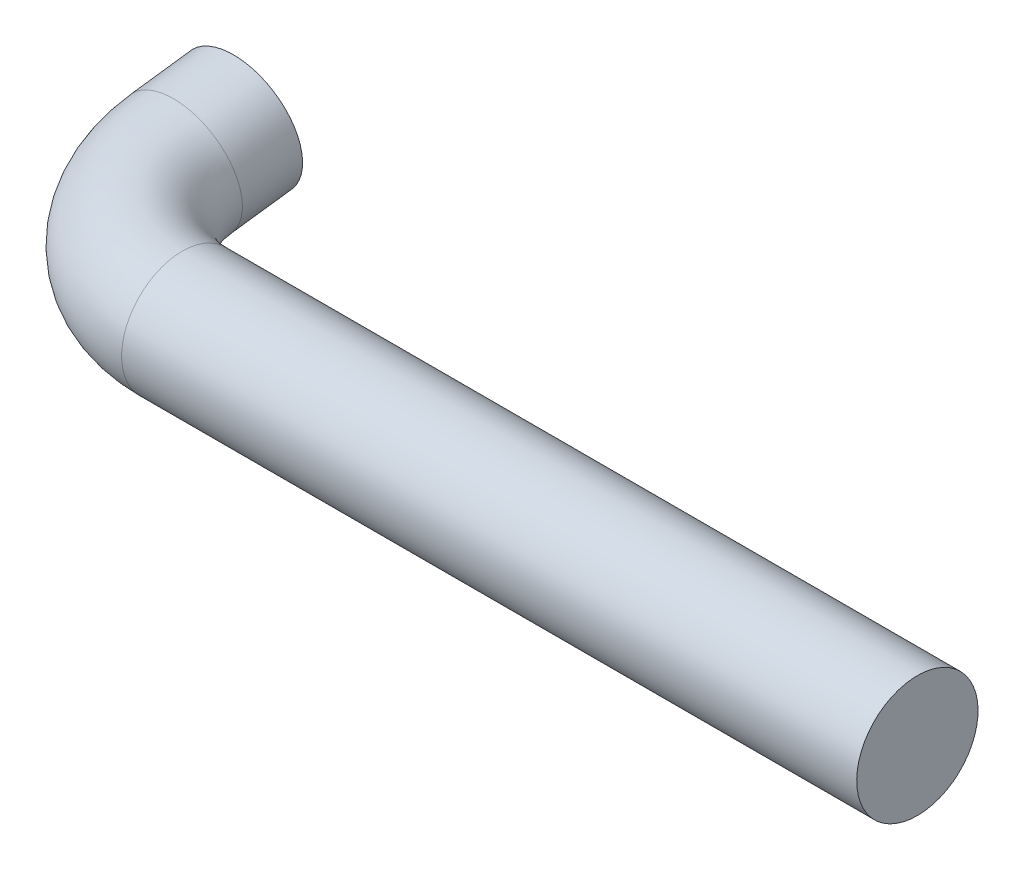
ISO-10303-21;
HEADER;
FILE_DESCRIPTION(('STEP AP214'),'2;1');
FILE_NAME('part.step','',(''),(''),'','','');
FILE_SCHEMA(('AUTOMOTIVE_DESIGN { 1 0 10303 214 1 1 1 1 }'));
ENDSEC;
DATA;
#1=APPLICATION_CONTEXT('core data for automotive mechanical design processes');
#2=APPLICATION_PROTOCOL_DEFINITION('international standard','automotive_design',2000,#1);
#3=PRODUCT_CONTEXT('',#1,'mechanical');
#4=PRODUCT('Part','Part','',(#3));
#5=PRODUCT_RELATED_PRODUCT_CATEGORY('part','',(#4));
#6=PRODUCT_DEFINITION_FORMATION('','',#4);
#7=PRODUCT_DEFINITION_CONTEXT('part definition',#1,'design');
#8=PRODUCT_DEFINITION('design','',#6,#7);
#9=PRODUCT_DEFINITION_SHAPE('','',#8);
#10=(LENGTH_UNIT() NAMED_UNIT(*) SI_UNIT(.MILLI.,.METRE.));
#11=(NAMED_UNIT(*) PLANE_ANGLE_UNIT() SI_UNIT($,.RADIAN.));
#12=(NAMED_UNIT(*) SI_UNIT($,.STERADIAN.) SOLID_ANGLE_UNIT());
#13=UNCERTAINTY_MEASURE_WITH_UNIT(LENGTH_MEASURE(1.E-05),#10,'distance_accuracy_value','');
#14=(GEOMETRIC_REPRESENTATION_CONTEXT(3) GLOBAL_UNCERTAINTY_ASSIGNED_CONTEXT((#13)) GLOBAL_UNIT_ASSIGNED_CONTEXT((#10,
#11,#12)) REPRESENTATION_CONTEXT('',''));
#15=CARTESIAN_POINT('',(0.,0.,0.));
#16=DIRECTION('',(0.,0.,1.));
#17=DIRECTION('',(1.,0.,0.));
#18=AXIS2_PLACEMENT_3D('',#15,#16,#17);
#19=CARTESIAN_POINT('',(56.7,2.652509785563,34.287475540671));
#20=DIRECTION('',(1.,0.,0.));
#21=DIRECTION('',(0.,1.,0.));
#22=AXIS2_PLACEMENT_3D('',#19,#20,#21);
#23=PLANE('',#22);
#24=CARTESIAN_POINT('',(56.7,2.652509785563,34.287475540671));
#25=DIRECTION('',(-1.,0.,0.));
#26=DIRECTION('',(0.,-0.991562225918097,-0.129631601596019));
#27=AXIS2_PLACEMENT_3D('',#24,#25,#26);
#28=CIRCLE('',#27,1.5);
#29=CARTESIAN_POINT('',(56.7,1.16516644668585,34.093028138277));
#30=VERTEX_POINT('',#29);
#31=EDGE_CURVE('E47',#30,#30,#28,.T.);
#32=ORIENTED_EDGE('',*,*,#31,.F.);
#33=EDGE_LOOP('',(#32));
#34=FACE_BOUND('',#33,.T.);
#35=ADVANCED_FACE('F14',(#34),#23,.T.);
#36=CARTESIAN_POINT('',(38.525036827418,2.652509785563,34.287475540671));
#37=DIRECTION('',(1.,0.,0.));
#38=DIRECTION('',(0.,-0.991562225918098,-0.129631601596013));
#39=AXIS2_PLACEMENT_3D('',#36,#37,#38);
#40=CYLINDRICAL_SURFACE('',#39,1.5);
#41=ORIENTED_EDGE('',*,*,#31,.T.);
#42=CARTESIAN_POINT('',(38.525036827418,1.16516644668585,34.093028138277));
#43=DIRECTION('',(1.,0.,0.));
#44=VECTOR('',#43,1.);
#45=LINE('',#42,#44);
#46=CARTESIAN_POINT('',(38.525036827418,1.1651664466864,34.0930281382766));
#47=VERTEX_POINT('',#46);
#48=EDGE_CURVE('E51',#47,#30,#45,.T.);
#49=ORIENTED_EDGE('',*,*,#48,.F.);
#50=CARTESIAN_POINT('',(38.525036827418,1.16516644668696,34.0930281382761));
#51=CARTESIAN_POINT('',(38.525036827418,1.16198428905221,34.1173646938345));
#52=CARTESIAN_POINT('',(38.525036827418,1.1594004612545,34.1417794271937));
#53=CARTESIAN_POINT('',(38.525036827418,1.1554334088696,34.1907062473126));
#54=CARTESIAN_POINT('',(38.525036827418,1.1540501842824,34.2152183340723));
#55=CARTESIAN_POINT('',(38.525036827418,1.15248828185492,34.2642808587907));
#56=CARTESIAN_POINT('',(38.525036827418,1.15230960401465,34.2888312967494));
#57=CARTESIAN_POINT('',(38.525036827418,1.15315706175374,34.3379113664302));
#58=CARTESIAN_POINT('',(38.525036827418,1.15418319733311,34.3624409981522));
#59=CARTESIAN_POINT('',(38.525036827418,1.15743785374516,34.4114203648868));
#60=CARTESIAN_POINT('',(38.525036827418,1.15966637457783,34.4358700998993));
#61=CARTESIAN_POINT('',(38.525036827418,1.16532042103587,34.4846307707081));
#62=CARTESIAN_POINT('',(38.525036827418,1.16874594666124,34.5089417065044));
#63=CARTESIAN_POINT('',(38.525036827418,1.17678575346415,34.5573662119625));
#64=CARTESIAN_POINT('',(38.525036827418,1.18140003464168,34.5814797816244));
#65=CARTESIAN_POINT('',(38.525036827418,1.19180623549716,34.6294514630437));
#66=CARTESIAN_POINT('',(38.525036827418,1.1975981551751,34.6533095748012));
#67=CARTESIAN_POINT('',(38.525036827418,1.21034568001579,34.7007128641492));
#68=CARTESIAN_POINT('',(38.525036827418,1.21730128517854,34.7242580417398));
#69=CARTESIAN_POINT('',(38.525036827418,1.23235942426614,34.7709787403539));
#70=CARTESIAN_POINT('',(38.525036827418,1.240461958191,34.7941542613775));
#71=CARTESIAN_POINT('',(38.525036827418,1.25779443510516,34.8400798149989));
#72=CARTESIAN_POINT('',(38.525036827418,1.26702437809445,34.8628298475967));
#73=CARTESIAN_POINT('',(38.525036827418,1.28658943739201,34.9078496175451));
#74=CARTESIAN_POINT('',(38.525036827418,1.29692455370028,34.9301193548956));
#75=CARTESIAN_POINT('',(38.525036827418,1.31867506143651,34.9741248846016));
#76=CARTESIAN_POINT('',(38.525036827418,1.33009045286447,34.995860676957));
#77=CARTESIAN_POINT('',(38.525036827418,1.35397401016198,35.0387459532452));
#78=CARTESIAN_POINT('',(38.525036827418,1.36644217603151,35.0598954371779));
#79=CARTESIAN_POINT('',(38.525036827418,1.39240124530858,35.1015571456614));
#80=CARTESIAN_POINT('',(38.525036827418,1.4058921487161,35.1220693702122));
#81=CARTESIAN_POINT('',(38.525036827418,1.43386419230116,35.1624071441861));
#82=CARTESIAN_POINT('',(38.525036827418,1.44834533247868,35.1822326936093));
#83=CARTESIAN_POINT('',(38.525036827418,1.47826296326864,35.221149355843));
#84=CARTESIAN_POINT('',(38.525036827418,1.49369945388108,35.2402404686535));
#85=CARTESIAN_POINT('',(38.525036827418,1.52549059768292,35.2776422654989));
#86=CARTESIAN_POINT('',(38.525036827418,1.54184525087231,35.2959529495338));
#87=CARTESIAN_POINT('',(38.525036827418,1.57543332003602,35.3317497767864));
#88=CARTESIAN_POINT('',(38.525036827418,1.59266673601033,35.349235920004));
#89=CARTESIAN_POINT('',(38.525036827418,1.62797081393533,35.3833415399714));
#90=CARTESIAN_POINT('',(38.525036827418,1.64604147588602,35.3999610167212));
#91=CARTESIAN_POINT('',(38.525036827418,1.68297651195631,35.4322932659776));
#92=CARTESIAN_POINT('',(38.525036827418,1.70184088607593,35.4480060384843));
#93=CARTESIAN_POINT('',(38.525036827418,1.7403179005545,35.4784870258094));
#94=CARTESIAN_POINT('',(38.525036827418,1.75993054091346,35.4932552406277));
#95=CARTESIAN_POINT('',(38.525036827418,1.79985683930225,35.5218115346531));
#96=CARTESIAN_POINT('',(38.525036827418,1.82017049733208,35.5355996138601));
#97=CARTESIAN_POINT('',(38.525036827418,1.86144989368112,35.5621624199723));
#98=CARTESIAN_POINT('',(38.525036827418,1.88241563200035,35.5749371468775));
#99=CARTESIAN_POINT('',(38.525036827418,1.9249486806282,35.5994424729499));
#100=CARTESIAN_POINT('',(38.525036827418,1.94651599093684,35.6111730721171));
#101=CARTESIAN_POINT('',(38.525036827418,1.9902002260039,35.6335618826729));
#102=CARTESIAN_POINT('',(38.525036827418,2.01231715076233,35.6442200940614));
#103=CARTESIAN_POINT('',(38.525036827418,2.05704733312004,35.6644384524948));
#104=CARTESIAN_POINT('',(38.525036827418,2.07966059071932,35.6739985995397));
#105=CARTESIAN_POINT('',(38.525036827418,2.12532896144047,35.6919977980543));
#106=CARTESIAN_POINT('',(38.525036827418,2.14838407456235,35.7004368495241));
#107=CARTESIAN_POINT('',(38.525036827418,2.1948806145418,35.7161735264743));
#108=CARTESIAN_POINT('',(38.525036827418,2.21832204139938,35.7234711519547));
#109=CARTESIAN_POINT('',(38.525036827418,2.26553473639971,35.7369073963072));
#110=CARTESIAN_POINT('',(38.525036827418,2.28930600454246,35.7430460151793));
#111=CARTESIAN_POINT('',(38.525036827418,2.33712111504606,35.7541494578447));
#112=CARTESIAN_POINT('',(38.525036827418,2.36116495740691,35.759114281638));
#113=CARTESIAN_POINT('',(38.525036827418,2.40946729262448,35.7678581734503));
#114=CARTESIAN_POINT('',(38.525036827418,2.43372578548119,35.7716372414693));
#115=CARTESIAN_POINT('',(38.525036827418,2.48239898085639,35.7780005176273));
#116=CARTESIAN_POINT('',(38.525036827418,2.50681368337488,35.7805847257662));
#117=CARTESIAN_POINT('',(38.525036827418,2.55574048091679,35.7845520565802));
#118=CARTESIAN_POINT('',(38.525036827418,2.58025257594022,35.7859351792553));
#119=CARTESIAN_POINT('',(38.525036827418,2.62931510670808,35.7874970070779));
#120=CARTESIAN_POINT('',(38.525036827418,2.65386554245252,35.7876757122255));
#121=CARTESIAN_POINT('',(38.525036827418,2.70294561051234,35.7868282744767));
#122=CARTESIAN_POINT('',(38.525036827418,2.72747524282773,35.7858021315803));
#123=CARTESIAN_POINT('',(38.525036827418,2.77645460999665,35.7825474698119));
#124=CARTESIAN_POINT('',(38.525036827418,2.80090434485019,35.7803189509398));
#125=CARTESIAN_POINT('',(38.525036827418,2.84966501554262,35.774664905917));
#126=CARTESIAN_POINT('',(38.525036827418,2.8739759513815,35.7712393797663));
#127=CARTESIAN_POINT('',(38.525036827418,2.9224004568708,35.7631995725788));
#128=CARTESIAN_POINT('',(38.525036827418,2.94651402652122,35.758585291542));
#129=CARTESIAN_POINT('',(38.525036827418,2.99448570793218,35.7481790907896));
#130=CARTESIAN_POINT('',(38.525036827418,3.01834381969273,35.742387171074));
#131=CARTESIAN_POINT('',(38.525036827418,3.06574710904302,35.7296396462057));
#132=CARTESIAN_POINT('',(38.525036827418,3.08929228663276,35.722684041053));
#133=CARTESIAN_POINT('',(38.525036827418,3.13601298524629,35.7076259019728));
#134=CARTESIAN_POINT('',(38.525036827418,3.15918850627008,35.6995233680452));
#135=CARTESIAN_POINT('',(38.525036827418,3.20511405989164,35.6821908911291));
#136=CARTESIAN_POINT('',(38.525036827418,3.2278640924894,35.6729609481405));
#137=CARTESIAN_POINT('',(38.525036827418,3.27288386243771,35.6533958888435));
#138=CARTESIAN_POINT('',(38.525036827418,3.29515359978826,35.6430607725351));
#139=CARTESIAN_POINT('',(38.525036827418,3.33915912949425,35.6213102647987));
#140=CARTESIAN_POINT('',(38.525036827418,3.3608949218497,35.6098948733708));
#141=CARTESIAN_POINT('',(38.525036827418,3.40378019813788,35.5860113160733));
#142=CARTESIAN_POINT('',(38.525036827418,3.42492968207062,35.5735431502037));
#143=CARTESIAN_POINT('',(38.525036827418,3.46659139055411,35.5475840809267));
#144=CARTESIAN_POINT('',(38.525036827418,3.48710361510486,35.5340931775191));
#145=CARTESIAN_POINT('',(38.525036827418,3.52744138907878,35.5061211339341));
#146=CARTESIAN_POINT('',(38.525036827418,3.54726693850195,35.4916399937566));
#147=CARTESIAN_POINT('',(38.525036827418,3.58618360073563,35.4617223629666));
#148=CARTESIAN_POINT('',(38.525036827418,3.60527471354614,35.4462858723542));
#149=CARTESIAN_POINT('',(38.525036827418,3.64267651039156,35.4144947285523));
#150=CARTESIAN_POINT('',(38.525036827418,3.66098719442648,35.3981400753629));
#151=CARTESIAN_POINT('',(38.525036827418,3.69678402167903,35.3645520061992));
#152=CARTESIAN_POINT('',(38.525036827418,3.71427016489667,35.3473185902249));
#153=CARTESIAN_POINT('',(38.525036827418,3.74837578486407,35.3120145122999));
#154=CARTESIAN_POINT('',(38.525036827418,3.76499526161382,35.2939438503492));
#155=CARTESIAN_POINT('',(38.525036827418,3.79732751087027,35.2570088142789));
#156=CARTESIAN_POINT('',(38.525036827418,3.81304028337696,35.2381444401593));
#157=CARTESIAN_POINT('',(38.525036827418,3.84352127070202,35.1996674256808));
#158=CARTESIAN_POINT('',(38.525036827418,3.85828948552039,35.1800547853218));
#159=CARTESIAN_POINT('',(38.525036827418,3.88684577954578,35.140128486933));
#160=CARTESIAN_POINT('',(38.525036827418,3.9006338587528,35.1198148289032));
#161=CARTESIAN_POINT('',(38.525036827418,3.92719666486499,35.0785354325541));
#162=CARTESIAN_POINT('',(38.525036827418,3.93997139177015,35.0575696942349));
#163=CARTESIAN_POINT('',(38.525036827418,3.96447671784256,35.0150366456071));
#164=CARTESIAN_POINT('',(38.525036827418,3.97620731700982,34.9934693352984));
#165=CARTESIAN_POINT('',(38.525036827418,3.99859612756555,34.9497851002314));
#166=CARTESIAN_POINT('',(38.525036827418,4.00925433895403,34.9276681754729));
#167=CARTESIAN_POINT('',(38.525036827418,4.02947269738742,34.8829379931152));
#168=CARTESIAN_POINT('',(38.525036827418,4.03903284443234,34.8603247355159));
#169=CARTESIAN_POINT('',(38.525036827418,4.057032042947,34.8146563647948));
#170=CARTESIAN_POINT('',(38.525036827418,4.06547109441675,34.7916012516729));
#171=CARTESIAN_POINT('',(38.525036827418,4.08120777136693,34.7451047116934));
#172=CARTESIAN_POINT('',(38.525036827418,4.08850539684735,34.7216632848359));
#173=CARTESIAN_POINT('',(38.525036827418,4.10194164119989,34.6744505898355));
#174=CARTESIAN_POINT('',(38.525036827418,4.108080260072,34.6506793216928));
#175=CARTESIAN_POINT('',(38.525036827418,4.11918370273738,34.6028642111892));
#176=CARTESIAN_POINT('',(38.525036827418,4.12414852653065,34.5788203688283));
#177=CARTESIAN_POINT('',(38.525036827418,4.13289241834295,34.5305180336108));
#178=CARTESIAN_POINT('',(38.525036827418,4.13667148636198,34.5062595407541));
#179=CARTESIAN_POINT('',(38.525036827418,4.14303476251994,34.4575863453789));
#180=CARTESIAN_POINT('',(38.525036827418,4.14561897065887,34.4331716428604));
#181=CARTESIAN_POINT('',(38.525036827418,4.14958630147288,34.3842448453185));
#182=CARTESIAN_POINT('',(38.525036827418,4.15096942414795,34.359732750295));
#183=CARTESIAN_POINT('',(38.525036827418,4.15253125197058,34.3106702195272));
#184=CARTESIAN_POINT('',(38.525036827418,4.15270995711812,34.2861197837827));
#185=CARTESIAN_POINT('',(38.525036827418,4.15186251936934,34.2370397157229));
#186=CARTESIAN_POINT('',(38.525036827418,4.150836376473,34.2125100834075));
#187=CARTESIAN_POINT('',(38.525036827418,4.14758171470457,34.1635307162386));
#188=CARTESIAN_POINT('',(38.525036827418,4.14535319583247,34.1390809813851));
#189=CARTESIAN_POINT('',(38.525036827418,4.13969915080967,34.0903203106926));
#190=CARTESIAN_POINT('',(38.525036827418,4.13627362465897,34.0660093748538));
#191=CARTESIAN_POINT('',(38.525036827418,4.12823381747149,34.0175848693645));
#192=CARTESIAN_POINT('',(38.525036827418,4.12361953643472,33.993471299714));
#193=CARTESIAN_POINT('',(38.525036827418,4.11321333568229,33.9454996183031));
#194=CARTESIAN_POINT('',(38.525036827418,4.10742141596663,33.9216415065425));
#195=CARTESIAN_POINT('',(38.525036827418,4.09467389109833,33.8742382171922));
#196=CARTESIAN_POINT('',(38.525036827418,4.08771828594569,33.8506930396025));
#197=CARTESIAN_POINT('',(38.525036827418,4.07266014686548,33.803972340989));
#198=CARTESIAN_POINT('',(38.525036827418,4.06455761293791,33.7807968199652));
#199=CARTESIAN_POINT('',(38.525036827418,4.04722513602178,33.7348712663436));
#200=CARTESIAN_POINT('',(38.525036827418,4.03799519303321,33.7121212337458));
#201=CARTESIAN_POINT('',(38.525036827418,4.01843013373618,33.6671014637975));
#202=CARTESIAN_POINT('',(38.525036827418,4.00809501742772,33.644831726447));
#203=CARTESIAN_POINT('',(38.525036827418,3.98634450969135,33.600826196741));
#204=CARTESIAN_POINT('',(38.525036827418,3.97492911826343,33.5790904043856));
#205=CARTESIAN_POINT('',(38.525036827418,3.95104556096597,33.5362051280974));
#206=CARTESIAN_POINT('',(38.525036827418,3.93857739509642,33.5150556441646));
#207=CARTESIAN_POINT('',(38.525036827418,3.91261832581934,33.4733939356811));
#208=CARTESIAN_POINT('',(38.525036827418,3.89912742241182,33.4528817111304));
#209=CARTESIAN_POINT('',(38.525036827418,3.87115537882677,33.4125439371565));
#210=CARTESIAN_POINT('',(38.525036827418,3.85667423864925,33.3927183877333));
#211=CARTESIAN_POINT('',(38.525036827418,3.82675660785928,33.3538017254996));
#212=CARTESIAN_POINT('',(38.525036827418,3.81132011724684,33.3347106126891));
#213=CARTESIAN_POINT('',(38.525036827418,3.77952897344501,33.2973088158437));
#214=CARTESIAN_POINT('',(38.525036827418,3.76317432025562,33.2789981318088));
#215=CARTESIAN_POINT('',(38.525036827418,3.72958625109191,33.2432013045562));
#216=CARTESIAN_POINT('',(38.525036827418,3.71235283511759,33.2257151613386));
#217=CARTESIAN_POINT('',(38.525036827418,3.6770487571926,33.1916095413712));
#218=CARTESIAN_POINT('',(38.525036827418,3.65897809524191,33.1749900646214));
#219=CARTESIAN_POINT('',(38.525036827418,3.62204305917161,33.142657815365));
#220=CARTESIAN_POINT('',(38.525036827418,3.603178685052,33.1269450428583));
#221=CARTESIAN_POINT('',(38.525036827418,3.56470167057342,33.0964640555332));
#222=CARTESIAN_POINT('',(38.525036827418,3.54508903021446,33.0816958407149));
#223=CARTESIAN_POINT('',(38.525036827418,3.50516273182568,33.0531395466895));
#224=CARTESIAN_POINT('',(38.525036827418,3.48484907379585,33.0393514674824));
#225=CARTESIAN_POINT('',(38.525036827418,3.44356967744681,33.0127886613703));
#226=CARTESIAN_POINT('',(38.525036827418,3.42260393912758,33.0000139344651));
#227=CARTESIAN_POINT('',(38.525036827418,3.38007089049972,32.9755086083927));
#228=CARTESIAN_POINT('',(38.525036827418,3.35850358019109,32.9637780092254));
#229=CARTESIAN_POINT('',(38.525036827418,3.31481934512403,32.9413891986697));
#230=CARTESIAN_POINT('',(38.525036827418,3.2927024203656,32.9307309872812));
#231=CARTESIAN_POINT('',(38.525036827418,3.24797223800789,32.9105126288478));
#232=CARTESIAN_POINT('',(38.525036827418,3.22535898040861,32.9009524818029));
#233=CARTESIAN_POINT('',(38.525036827418,3.17969060968746,32.8829532832882));
#234=CARTESIAN_POINT('',(38.525036827418,3.15663549656558,32.8745142318185));
#235=CARTESIAN_POINT('',(38.525036827418,3.11013895658612,32.8587775548683));
#236=CARTESIAN_POINT('',(38.525036827418,3.08669752972855,32.8514799293879));
#237=CARTESIAN_POINT('',(38.525036827418,3.03948483472822,32.8380436850354));
#238=CARTESIAN_POINT('',(38.525036827418,3.01571356658547,32.8319050661633));
#239=CARTESIAN_POINT('',(38.525036827418,2.96789845608187,32.8208016234979));
#240=CARTESIAN_POINT('',(38.525036827418,2.94385461372102,32.8158367997046));
#241=CARTESIAN_POINT('',(38.525036827418,2.89555227850345,32.8070929078923));
#242=CARTESIAN_POINT('',(38.525036827418,2.87129378564674,32.8033138398733));
#243=CARTESIAN_POINT('',(38.525036827418,2.82262059027154,32.7969505637153));
#244=CARTESIAN_POINT('',(38.525036827418,2.79820588775305,32.7943663555764));
#245=CARTESIAN_POINT('',(38.525036827418,2.74927909021114,32.7903990247624));
#246=CARTESIAN_POINT('',(38.525036827418,2.72476699518771,32.7890159020873));
#247=CARTESIAN_POINT('',(38.525036827418,2.67570446441985,32.7874540742647));
#248=CARTESIAN_POINT('',(38.525036827418,2.65115402867541,32.7872753691171));
#249=CARTESIAN_POINT('',(38.525036827418,2.60207396061558,32.7881228068659));
#250=CARTESIAN_POINT('',(38.525036827418,2.5775443283002,32.7891489497623));
#251=CARTESIAN_POINT('',(38.525036827418,2.52856496113128,32.7924036115307));
#252=CARTESIAN_POINT('',(38.525036827418,2.50411522627774,32.7946321304028));
#253=CARTESIAN_POINT('',(38.525036827418,2.45535455558531,32.8002861754256));
#254=CARTESIAN_POINT('',(38.525036827418,2.43104361974643,32.8037117015763));
#255=CARTESIAN_POINT('',(38.525036827418,2.38261911425713,32.8117515087638));
#256=CARTESIAN_POINT('',(38.525036827418,2.35850554460671,32.8163657898005));
#257=CARTESIAN_POINT('',(38.525036827418,2.31053386319575,32.826771990553));
#258=CARTESIAN_POINT('',(38.525036827418,2.2866757514352,32.8325639102686));
#259=CARTESIAN_POINT('',(38.525036827418,2.23927246208491,32.8453114351369));
#260=CARTESIAN_POINT('',(38.525036827418,2.21572728449517,32.8522670402896));
#261=CARTESIAN_POINT('',(38.525036827418,2.16900658588164,32.8673251793698));
#262=CARTESIAN_POINT('',(38.525036827418,2.14583106485785,32.8754277132973));
#263=CARTESIAN_POINT('',(38.525036827418,2.09990551123629,32.8927601902135));
#264=CARTESIAN_POINT('',(38.525036827418,2.07715547863852,32.901990133202));
#265=CARTESIAN_POINT('',(38.525036827418,2.03213570869021,32.9215551924991));
#266=CARTESIAN_POINT('',(38.525036827418,2.00986597133967,32.9318903088075));
#267=CARTESIAN_POINT('',(38.525036827418,1.96586044163368,32.9536408165439));
#268=CARTESIAN_POINT('',(38.525036827418,1.94412464927823,32.9650562079718));
#269=CARTESIAN_POINT('',(38.525036827418,1.90123937299004,32.9889397652693));
#270=CARTESIAN_POINT('',(38.525036827418,1.88008988905731,33.0014079311388));
#271=CARTESIAN_POINT('',(38.525036827418,1.83842818057382,33.0273670004159));
#272=CARTESIAN_POINT('',(38.525036827418,1.81791595602307,33.0408579038234));
#273=CARTESIAN_POINT('',(38.525036827418,1.77757818204915,33.0688299474085));
#274=CARTESIAN_POINT('',(38.525036827418,1.75775263262598,33.083311087586));
#275=CARTESIAN_POINT('',(38.525036827418,1.7188359703923,33.113228718376));
#276=CARTESIAN_POINT('',(38.525036827418,1.69974485758179,33.1286652089884));
#277=CARTESIAN_POINT('',(38.525036827418,1.66234306073636,33.1604563527902));
#278=CARTESIAN_POINT('',(38.525036827418,1.64403237670145,33.1768110059796));
#279=CARTESIAN_POINT('',(38.525036827418,1.6082355494489,33.2103990751433));
#280=CARTESIAN_POINT('',(38.525036827418,1.59074940623128,33.2276324911177));
#281=CARTESIAN_POINT('',(38.525036827418,1.55664378626384,33.2629365690427));
#282=CARTESIAN_POINT('',(38.525036827418,1.54002430951403,33.2810072309933));
#283=CARTESIAN_POINT('',(38.525036827418,1.50769206025773,33.3179422670636));
#284=CARTESIAN_POINT('',(38.525036827418,1.49197928775123,33.3368066411833));
#285=CARTESIAN_POINT('',(38.525036827418,1.46149830042565,33.3752836556618));
#286=CARTESIAN_POINT('',(38.525036827418,1.44673008560656,33.3948962960206));
#287=CARTESIAN_POINT('',(38.525036827418,1.41817379158312,33.4348225944098));
#288=CARTESIAN_POINT('',(38.525036827418,1.40438571237877,33.4551362524401));
#289=CARTESIAN_POINT('',(38.525036827418,1.37782290625929,33.4964156487878));
#290=CARTESIAN_POINT('',(38.525036827418,1.36504817934415,33.5173813871052));
#291=CARTESIAN_POINT('',(38.525036827418,1.34054285329899,33.559914435738));
#292=CARTESIAN_POINT('',(38.525036827418,1.32881225416897,33.5814817460534));
#293=CARTESIAN_POINT('',(38.525036827418,1.30642344351151,33.625165981102));
#294=CARTESIAN_POINT('',(38.525036827418,1.29576523198406,33.6472829058353));
#295=CARTESIAN_POINT('',(38.525036827418,1.27554687393033,33.6920130882617));
#296=CARTESIAN_POINT('',(38.525036827418,1.26598672740405,33.7146263459549));
#297=CARTESIAN_POINT('',(38.525036827418,1.24798752747246,33.7602947164195));
#298=CARTESIAN_POINT('',(38.525036827418,1.23954847406716,33.783349829191));
#299=CARTESIAN_POINT('',(38.525036827418,1.22381180240501,33.8298463701278));
#300=CARTESIAN_POINT('',(38.525036827418,1.21651418414816,33.853287798293));
#301=CARTESIAN_POINT('',(38.525036827418,1.20307792006045,33.9005004897208));
#302=CARTESIAN_POINT('',(38.525036827418,1.1969392742296,33.9242717529833));
#303=CARTESIAN_POINT('',(38.525036827418,1.18583590521687,33.9720868768198));
#304=CARTESIAN_POINT('',(38.525036827418,1.180871182035,33.9961307373938));
#305=CARTESIAN_POINT('',(38.525036827418,1.17212701534725,34.0444330228522));
#306=CARTESIAN_POINT('',(38.525036827418,1.16834757184137,34.0686914477367));
#307=CARTESIAN_POINT('',(38.525036827418,1.16516644668697,34.0930281382761));
#308=B_SPLINE_CURVE_WITH_KNOTS('',3,(#50,#51,#52,#53,#54,#55,#56,#57,#58,#59,#60,#61,#62,#63,
#64,#65,#66,#67,#68,#69,#70,#71,#72,#73,#74,#75,#76,#77,#78,#79,#80,#81,#82,#83,#84,#85,#86,#87,
#88,#89,#90,#91,#92,#93,#94,#95,#96,#97,#98,#99,#100,#101,#102,#103,#104,#105,#106,#107,#108,
#109,#110,#111,#112,#113,#114,#115,#116,#117,#118,#119,#120,#121,#122,#123,#124,#125,#126,#127,
#128,#129,#130,#131,#132,#133,#134,#135,#136,#137,#138,#139,#140,#141,#142,#143,#144,#145,#146,
#147,#148,#149,#150,#151,#152,#153,#154,#155,#156,#157,#158,#159,#160,#161,#162,#163,#164,#165,
#166,#167,#168,#169,#170,#171,#172,#173,#174,#175,#176,#177,#178,#179,#180,#181,#182,#183,#184,
#185,#186,#187,#188,#189,#190,#191,#192,#193,#194,#195,#196,#197,#198,#199,#200,#201,#202,#203,
#204,#205,#206,#207,#208,#209,#210,#211,#212,#213,#214,#215,#216,#217,#218,#219,#220,#221,#222,
#223,#224,#225,#226,#227,#228,#229,#230,#231,#232,#233,#234,#235,#236,#237,#238,#239,#240,#241,
#242,#243,#244,#245,#246,#247,#248,#249,#250,#251,#252,#253,#254,#255,#256,#257,#258,#259,#260,
#261,#262,#263,#264,#265,#266,#267,#268,#269,#270,#271,#272,#273,#274,#275,#276,#277,#278,#279,
#280,#281,#282,#283,#284,#285,#286,#287,#288,#289,#290,#291,#292,#293,#294,#295,#296,#297,#298,
#299,#300,#301,#302,#303,#304,#305,#306,#307),.UNSPECIFIED.,.F.,.F.,(4,2,2,2,2,2,2,2,2,2,2,2,2,
2,2,2,2,2,2,2,2,2,2,2,2,2,2,2,2,2,2,2,2,2,2,2,2,2,2,2,2,2,2,2,2,2,2,2,2,2,2,2,2,2,2,2,2,2,2,2,2,
2,2,2,2,2,2,2,2,2,2,2,2,2,2,2,2,2,2,2,2,2,2,2,2,2,2,2,2,2,2,2,2,2,2,2,2,2,2,2,2,2,2,2,2,2,2,2,2,
2,2,2,2,2,2,2,2,2,2,2,2,2,2,2,2,2,2,2,4),(0.,0.0736236855687353,0.147247371137472,
0.220871056706209,0.294494742274941,0.368118427843682,0.441742113412415,0.515365798981158,
0.588989484549892,0.662613170118631,0.736236855687367,0.809860541256099,0.88348422682484,
0.957107912393578,1.03073159796231,1.10435528353105,1.17797896909978,1.25160265466852,
1.32522634023726,1.398850025806,1.47247371137473,1.54609739694347,1.61972108251221,
1.69334476808094,1.76696845364968,1.84059213921842,1.91421582478715,1.98783951035589,
2.06146319592463,2.13508688149336,2.2087105670621,2.28233425263084,2.35595793819957,
2.42958162376831,2.50320530933705,2.57682899490578,2.65045268047452,2.72407636604326,
2.79770005161199,2.87132373718073,2.94494742274947,3.01857110831821,3.09219479388694,
3.16581847945568,3.23944216502442,3.31306585059315,3.38668953616189,3.46031322173063,
3.53393690729936,3.6075605928681,3.68118427843684,3.75480796400557,3.82843164957431,
3.90205533514304,3.97567902071179,4.04930270628052,4.12292639184926,4.19655007741799,
4.27017376298673,4.34379744855547,4.41742113412421,4.49104481969294,4.56466850526168,
4.63829219083042,4.71191587639915,4.78553956196789,4.85916324753663,4.93278693310536,
5.0064106186741,5.08003430424284,5.15365798981158,5.22728167538031,5.30090536094905,
5.37452904651778,5.44815273208652,5.52177641765526,5.59540010322399,5.66902378879273,
5.74264747436147,5.8162711599302,5.88989484549894,5.96351853106768,6.03714221663641,
6.11076590220515,6.18438958777389,6.25801327334263,6.33163695891136,6.4052606444801,
6.47888433004883,6.55250801561757,6.62613170118631,6.69975538675505,6.77337907232378,
6.84700275789252,6.92062644346125,6.99425012902999,7.06787381459873,7.14149750016747,
7.2151211857362,7.28874487130494,7.36236855687368,7.43599224244241,7.50961592801115,
7.58323961357989,7.65686329914862,7.73048698471736,7.8041106702861,7.87773435585483,
7.95135804142357,8.02498172699231,8.09860541256104,8.17222909812978,8.24585278369852,
8.31947646926725,8.39310015483599,8.46672384040473,8.54034752597347,8.6139712115422,
8.68759489711094,8.76121858267968,8.83484226824841,8.90846595381715,8.98208963938589,
9.05571332495462,9.12933701052336,9.2029606960921,9.27658438166083,9.35020806722957,
9.42383175279831),.UNSPECIFIED.);
#309=EDGE_CURVE('E42',#47,#47,#308,.T.);
#310=ORIENTED_EDGE('',*,*,#309,.F.);
#311=ORIENTED_EDGE('',*,*,#48,.T.);
#312=EDGE_LOOP('',(#41,#49,#310,#311));
#313=FACE_BOUND('',#312,.T.);
#314=ADVANCED_FACE('F57',(#313),#40,.T.);
#315=CARTESIAN_POINT('',(35.525036827418,3.235851992747,29.82544552404));
#316=DIRECTION('',(0.,-0.129631601596013,0.991562225918098));
#317=DIRECTION('',(-1.,0.,0.));
#318=AXIS2_PLACEMENT_3D('',#315,#316,#317);
#319=PLANE('',#318);
#320=CARTESIAN_POINT('',(35.525036827418,3.235851992747,29.82544552404));
#321=DIRECTION('',(0.,-0.129631601596013,0.991562225918098));
#322=DIRECTION('',(0.,-0.991562225918098,-0.129631601596012));
#323=AXIS2_PLACEMENT_3D('',#320,#321,#322);
#324=CIRCLE('',#323,1.5);
#325=CARTESIAN_POINT('',(35.525036827418,1.74850865386989,29.6309981216457));
#326=VERTEX_POINT('',#325);
#327=EDGE_CURVE('E107',#326,#326,#324,.T.);
#328=ORIENTED_EDGE('',*,*,#327,.F.);
#329=EDGE_LOOP('',(#328));
#330=FACE_BOUND('',#329,.T.);
#331=ADVANCED_FACE('F66',(#330),#319,.F.);
#332=CARTESIAN_POINT('',(38.525036827418,3.041404590352,31.312788862917));
#333=DIRECTION('',(0.,-0.991562225918098,-0.129631601596013));
#334=DIRECTION('',(-1.,0.,0.));
#335=AXIS2_PLACEMENT_3D('',#332,#333,#334);
#336=TOROIDAL_SURFACE('',#335,3.,1.5);
#337=CARTESIAN_POINT('',(35.525036827418,1.55406125147485,31.118341460523));
#338=CARTESIAN_POINT('',(35.5250357861517,1.54769796868574,31.1670147066207));
#339=CARTESIAN_POINT('',(35.5262415760426,1.54133469738218,31.2156878648644));
#340=CARTESIAN_POINT('',(35.5310593415625,1.5286234783096,31.3129169704418));
#341=CARTESIAN_POINT('',(35.5346713171915,1.52227553054057,31.3614729177754));
#342=CARTESIAN_POINT('',(35.5442939776114,1.50961025910044,31.4583505663303));
#343=CARTESIAN_POINT('',(35.5503046624024,1.50329293542935,31.5066722675516));
#344=CARTESIAN_POINT('',(35.5647099326451,1.49070412908081,31.6029650286602));
#345=CARTESIAN_POINT('',(35.5731045180969,1.48443264640337,31.6509360885475));
#346=CARTESIAN_POINT('',(35.59225745432,1.47195063115334,31.7464119962188));
#347=CARTESIAN_POINT('',(35.6030158050913,1.46574009858075,31.7939168440028));
#348=CARTESIAN_POINT('',(35.6268703305778,1.45339494510728,31.8883458852762));
#349=CARTESIAN_POINT('',(35.639966505293,1.4472603242064,31.9352700787657));
#350=CARTESIAN_POINT('',(35.6684651351501,1.43508177295565,32.0284247666502));
#351=CARTESIAN_POINT('',(35.6838675902918,1.42903784260578,32.0746552610453));
#352=CARTESIAN_POINT('',(35.7169416734464,1.41705523280387,32.1663111775133));
#353=CARTESIAN_POINT('',(35.7346133014592,1.41111655335183,32.2117365995862));
#354=CARTESIAN_POINT('',(35.7721831583095,1.39935875214743,32.301672937567));
#355=CARTESIAN_POINT('',(35.792081387147,1.39353963039507,32.346183853475));
#356=CARTESIAN_POINT('',(35.8340565089489,1.38203496336326,32.4341839484368));
#357=CARTESIAN_POINT('',(35.8561334019134,1.37634941808381,32.4776731274907));
#358=CARTESIAN_POINT('',(35.902412666833,1.3651256009746,32.5635249795012));
#359=CARTESIAN_POINT('',(35.9266150387882,1.35958732914484,32.6058876524579));
#360=CARTESIAN_POINT('',(35.9770869560467,1.34867140111688,32.6893844368847));
#361=CARTESIAN_POINT('',(36.00335650135,1.34329374491868,32.7305185483549));
#362=CARTESIAN_POINT('',(36.0578994796714,1.33271200339867,32.8114591141312));
#363=CARTESIAN_POINT('',(36.0861729126895,1.32750791807686,32.8512655684373));
#364=CARTESIAN_POINT('',(36.1446555532633,1.31728585540699,32.9294549226505));
#365=CARTESIAN_POINT('',(36.174864760819,1.31226787805893,32.9678378225575));
#366=CARTESIAN_POINT('',(36.2371461738412,1.30243012008352,33.0430876002047));
#367=CARTESIAN_POINT('',(36.2692183793077,1.29761033945616,33.0799544779448));
#368=CARTESIAN_POINT('',(36.3351485233992,1.28818058619585,33.1520833957206));
#369=CARTESIAN_POINT('',(36.3690064620243,1.28357061356289,33.1873454357561));
#370=CARTESIAN_POINT('',(36.4384265056932,1.27457158211923,33.2561797287798));
#371=CARTESIAN_POINT('',(36.473988610737,1.27018252330853,33.2897519817678));
#372=CARTESIAN_POINT('',(36.5467313150176,1.26163589313649,33.3551258221983));
#373=CARTESIAN_POINT('',(36.5839119142543,1.25747832177516,33.3869274096407));
#374=CARTESIAN_POINT('',(36.6598020356005,1.24940468245543,33.4486833061703));
#375=CARTESIAN_POINT('',(36.6985115577099,1.24548861449704,33.4786376152574));
#376=CARTESIAN_POINT('',(36.7773662701722,1.23790741613389,33.5366267925224));
#377=CARTESIAN_POINT('',(36.817511460525,1.23424228572914,33.5646616607001));
#378=CARTESIAN_POINT('',(36.8991407961941,1.22717179209353,33.6187444176926));
#379=CARTESIAN_POINT('',(36.9406249415104,1.22376642886267,33.6447923065074));
#380=CARTESIAN_POINT('',(37.0248322481669,1.21722367339284,33.6948383531305));
#381=CARTESIAN_POINT('',(37.067555409507,1.21408628115387,33.7188365109389));
#382=CARTESIAN_POINT('',(37.1541378243736,1.20808702592165,33.7647252818764));
#383=CARTESIAN_POINT('',(37.1979970779002,1.2052251629284,33.7866158950056));
#384=CARTESIAN_POINT('',(37.2867460163547,1.19978386066203,33.8282368402127));
#385=CARTESIAN_POINT('',(37.3316357012827,1.19720442138891,33.8479671722906));
#386=CARTESIAN_POINT('',(37.4223373593633,1.19233418067369,33.8852200231764));
#387=CARTESIAN_POINT('',(37.4681493325159,1.19004337923158,33.9027425419843));
#388=CARTESIAN_POINT('',(37.5605852019673,1.18575593286094,33.9355375534973));
#389=CARTESIAN_POINT('',(37.6072090982662,1.1837592879324,33.9508100462022));
#390=CARTESIAN_POINT('',(37.7011564930435,1.18006496490075,33.9790682110588));
#391=CARTESIAN_POINT('',(37.7484799915219,1.17836728679763,33.9920538832105));
#392=CARTESIAN_POINT('',(37.843712583895,1.17527498645351,34.0157071296001));
#393=CARTESIAN_POINT('',(37.8916216777897,1.1738803642125,34.026374703838));
#394=CARTESIAN_POINT('',(37.9879100449498,1.17139753841464,34.0453660319122));
#395=CARTESIAN_POINT('',(38.0362893182152,1.17030933485779,34.0536897857484));
#396=CARTESIAN_POINT('',(38.1334014898889,1.16844195660481,34.0679735075752));
#397=CARTESIAN_POINT('',(38.1821343882973,1.16766278190868,34.0739334755658));
#398=CARTESIAN_POINT('',(38.2798364245615,1.16641538102683,34.083474942151));
#399=CARTESIAN_POINT('',(38.3288055624173,1.16594715484111,34.0870564407457));
#400=CARTESIAN_POINT('',(38.4268620464542,1.16532262018066,34.0918335550485));
#401=CARTESIAN_POINT('',(38.4759493926353,1.16516631170592,34.0930291707567));
#402=CARTESIAN_POINT('',(38.525036827418,1.16516644668694,34.0930281382763));
#403=B_SPLINE_CURVE_WITH_KNOTS('',3,(#337,#338,#339,#340,#341,#342,#343,#344,#345,#346,#347,
#348,#349,#350,#351,#352,#353,#354,#355,#356,#357,#358,#359,#360,#361,#362,#363,#364,#365,#366,
#367,#368,#369,#370,#371,#372,#373,#374,#375,#376,#377,#378,#379,#380,#381,#382,#383,#384,#385,
#386,#387,#388,#389,#390,#391,#392,#393,#394,#395,#396,#397,#398,#399,#400,#401,#402),
.UNSPECIFIED.,.F.,.F.,(4,2,2,2,2,2,2,2,2,2,2,2,2,2,2,2,2,2,2,2,2,2,2,2,2,2,2,2,2,2,2,2,4),(0.,
0.147247371137475,0.294494742274945,0.441742113412419,0.588989484549884,0.736236855687351,
0.883484226824816,1.03073159796228,1.17797896909975,1.32522634023721,1.47247371137467,
1.61972108251212,1.76696845364958,1.91421582478704,2.0614631959245,2.20871056706194,
2.35595793819939,2.50320530933684,2.65045268047429,2.79770005161174,2.94494742274918,
3.09219479388662,3.23944216502406,3.38668953616151,3.53393690729894,3.68118427843638,
3.82843164957382,3.97567902071125,4.12292639184868,4.27017376298611,4.41742113412354,
4.56466850526097,4.71191587639839),.UNSPECIFIED.);
#404=CARTESIAN_POINT('',(35.525036827418,1.55406125147537,31.1183414605228));
#405=VERTEX_POINT('',#404);
#406=EDGE_CURVE('E50',#405,#47,#403,.T.);
#407=ORIENTED_EDGE('',*,*,#406,.F.);
#408=CARTESIAN_POINT('',(35.525036827418,3.04140459035298,31.3127888629171));
#409=DIRECTION('',(0.,0.129631601596013,-0.991562225918098));
#410=DIRECTION('',(0.,-0.991562225918098,-0.129631601596012));
#411=AXIS2_PLACEMENT_3D('',#408,#409,#410);
#412=CIRCLE('',#411,1.5);
#413=EDGE_CURVE('E9',#405,#405,#412,.T.);
#414=ORIENTED_EDGE('',*,*,#413,.F.);
#415=ORIENTED_EDGE('',*,*,#406,.T.);
#416=ORIENTED_EDGE('',*,*,#309,.T.);
#417=EDGE_LOOP('',(#407,#414,#415,#416));
#418=FACE_BOUND('',#417,.T.);
#419=ADVANCED_FACE('F138',(#418),#336,.T.);
#420=CARTESIAN_POINT('',(35.525036827418,3.235851992747,29.82544552404));
#421=DIRECTION('',(0.,-0.129631601596013,0.991562225918098));
#422=DIRECTION('',(0.,-0.991562225918098,-0.129631601596013));
#423=AXIS2_PLACEMENT_3D('',#420,#421,#422);
#424=CYLINDRICAL_SURFACE('',#423,1.5);
#425=ORIENTED_EDGE('',*,*,#413,.T.);
#426=CARTESIAN_POINT('',(35.525036827418,1.74850865386996,29.6309981216451));
#427=DIRECTION('',(0.,-0.129631601596013,0.991562225918098));
#428=VECTOR('',#427,1.);
#429=LINE('',#426,#428);
#430=EDGE_CURVE('E26',#326,#405,#429,.T.);
#431=ORIENTED_EDGE('',*,*,#430,.F.);
#432=ORIENTED_EDGE('',*,*,#327,.T.);
#433=ORIENTED_EDGE('',*,*,#430,.T.);
#434=EDGE_LOOP('',(#425,#431,#432,#433));
#435=FACE_BOUND('',#434,.T.);
#436=ADVANCED_FACE('F149',(#435),#424,.T.);
#437=CLOSED_SHELL('',(#35,#314,#331,#419,#436));
#438=MANIFOLD_SOLID_BREP('B1',#437);
#439=ADVANCED_BREP_SHAPE_REPRESENTATION('',(#18,#438),#14);
#440=SHAPE_DEFINITION_REPRESENTATION(#9,#439);
ENDSEC;
END-ISO-10303-21;
